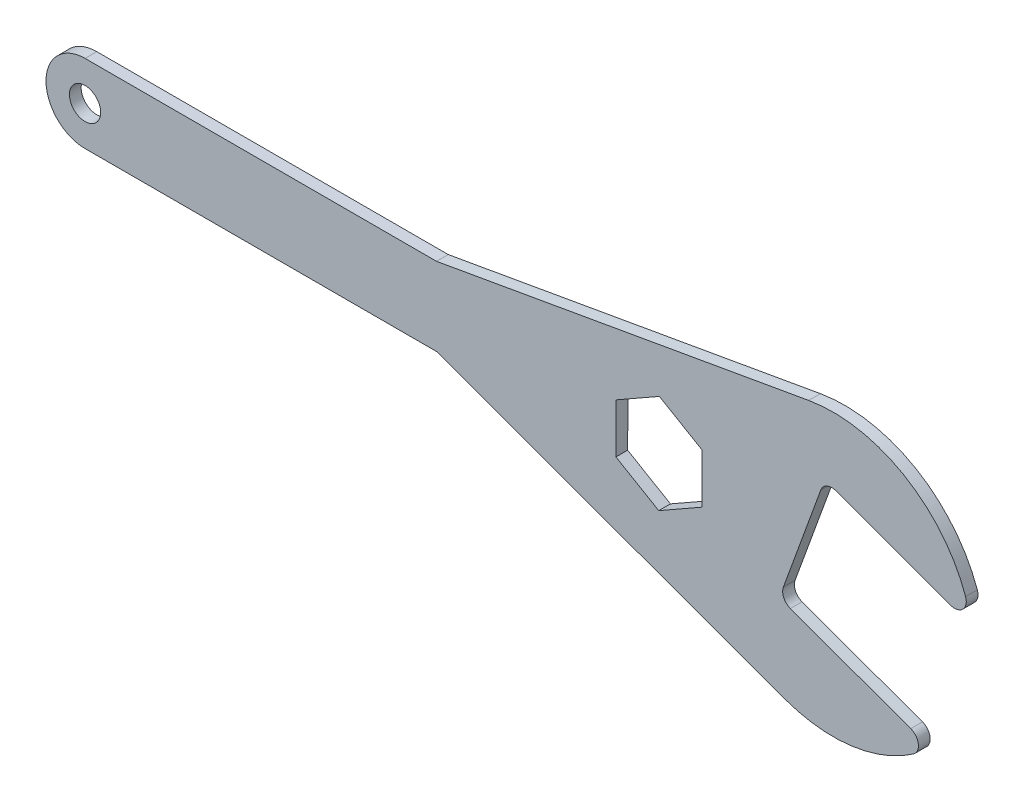
ISO-10303-21;
HEADER;
FILE_DESCRIPTION(('STEP AP214'),'2;1');
FILE_NAME('part.step','',(''),(''),'','','');
FILE_SCHEMA(('AUTOMOTIVE_DESIGN { 1 0 10303 214 1 1 1 1 }'));
ENDSEC;
DATA;
#1=APPLICATION_CONTEXT('core data for automotive mechanical design processes');
#2=APPLICATION_PROTOCOL_DEFINITION('international standard','automotive_design',2000,#1);
#3=PRODUCT_CONTEXT('',#1,'mechanical');
#4=PRODUCT('Part','Part','',(#3));
#5=PRODUCT_RELATED_PRODUCT_CATEGORY('part','',(#4));
#6=PRODUCT_DEFINITION_FORMATION('','',#4);
#7=PRODUCT_DEFINITION_CONTEXT('part definition',#1,'design');
#8=PRODUCT_DEFINITION('design','',#6,#7);
#9=PRODUCT_DEFINITION_SHAPE('','',#8);
#10=(LENGTH_UNIT() NAMED_UNIT(*) SI_UNIT(.MILLI.,.METRE.));
#11=(NAMED_UNIT(*) PLANE_ANGLE_UNIT() SI_UNIT($,.RADIAN.));
#12=(NAMED_UNIT(*) SI_UNIT($,.STERADIAN.) SOLID_ANGLE_UNIT());
#13=UNCERTAINTY_MEASURE_WITH_UNIT(LENGTH_MEASURE(1.E-05),#10,'distance_accuracy_value','');
#14=(GEOMETRIC_REPRESENTATION_CONTEXT(3) GLOBAL_UNCERTAINTY_ASSIGNED_CONTEXT((#13)) GLOBAL_UNIT_ASSIGNED_CONTEXT((#10,
#11,#12)) REPRESENTATION_CONTEXT('',''));
#15=CARTESIAN_POINT('',(0.,0.,0.));
#16=DIRECTION('',(0.,0.,1.));
#17=DIRECTION('',(1.,0.,0.));
#18=AXIS2_PLACEMENT_3D('',#15,#16,#17);
#19=CARTESIAN_POINT('',(90.,10.,3.));
#20=DIRECTION('',(0.173648177666924,-0.984807753012209,0.));
#21=DIRECTION('',(0.984807753012209,0.173648177666924,0.));
#22=AXIS2_PLACEMENT_3D('',#19,#20,#21);
#23=PLANE('',#22);
#24=DIRECTION('',(-0.984807753012209,-0.173648177666924,0.));
#25=VECTOR('',#24,1.);
#26=CARTESIAN_POINT('',(90.,10.,0.));
#27=LINE('',#26,#25);
#28=CARTESIAN_POINT('',(185.295586495551,26.8031830416023,0.));
#29=VERTEX_POINT('',#28);
#30=CARTESIAN_POINT('',(90.,10.,0.));
#31=VERTEX_POINT('',#30);
#32=EDGE_CURVE('E259',#29,#31,#27,.T.);
#33=ORIENTED_EDGE('',*,*,#32,.T.);
#34=DIRECTION('',(0.,0.,-1.));
#35=VECTOR('',#34,1.);
#36=CARTESIAN_POINT('',(90.,10.,3.));
#37=LINE('',#36,#35);
#38=CARTESIAN_POINT('',(90.,10.,3.));
#39=VERTEX_POINT('',#38);
#40=EDGE_CURVE('E296',#39,#31,#37,.T.);
#41=ORIENTED_EDGE('',*,*,#40,.F.);
#42=DIRECTION('',(-0.984807753012209,-0.173648177666924,0.));
#43=VECTOR('',#42,1.);
#44=CARTESIAN_POINT('',(90.,10.,3.));
#45=LINE('',#44,#43);
#46=CARTESIAN_POINT('',(185.295586495551,26.8031830416023,3.));
#47=VERTEX_POINT('',#46);
#48=EDGE_CURVE('E234',#47,#39,#45,.T.);
#49=ORIENTED_EDGE('',*,*,#48,.F.);
#50=DIRECTION('',(0.,0.,-1.));
#51=VECTOR('',#50,1.);
#52=CARTESIAN_POINT('',(185.295586495551,26.8031830416023,3.));
#53=LINE('',#52,#51);
#54=EDGE_CURVE('E258',#47,#29,#53,.T.);
#55=ORIENTED_EDGE('',*,*,#54,.T.);
#56=EDGE_LOOP('',(#33,#41,#49,#55));
#57=FACE_BOUND('',#56,.T.);
#58=ADVANCED_FACE('F36',(#57),#23,.F.);
#59=CARTESIAN_POINT('',(90.,10.,3.));
#60=DIRECTION('',(0.,-1.,0.));
#61=DIRECTION('',(1.,0.,0.));
#62=AXIS2_PLACEMENT_3D('',#59,#60,#61);
#63=PLANE('',#62);
#64=DIRECTION('',(-1.,0.,0.));
#65=VECTOR('',#64,1.);
#66=CARTESIAN_POINT('',(90.,10.,0.));
#67=LINE('',#66,#65);
#68=CARTESIAN_POINT('',(0.,10.,0.));
#69=VERTEX_POINT('',#68);
#70=EDGE_CURVE('E262',#31,#69,#67,.T.);
#71=ORIENTED_EDGE('',*,*,#70,.T.);
#72=DIRECTION('',(0.,0.,-1.));
#73=VECTOR('',#72,1.);
#74=CARTESIAN_POINT('',(0.,10.,3.));
#75=LINE('',#74,#73);
#76=CARTESIAN_POINT('',(0.,10.,3.));
#77=VERTEX_POINT('',#76);
#78=EDGE_CURVE('E293',#77,#69,#75,.T.);
#79=ORIENTED_EDGE('',*,*,#78,.F.);
#80=DIRECTION('',(-1.,0.,0.));
#81=VECTOR('',#80,1.);
#82=CARTESIAN_POINT('',(90.,10.,3.));
#83=LINE('',#82,#81);
#84=EDGE_CURVE('E237',#39,#77,#83,.T.);
#85=ORIENTED_EDGE('',*,*,#84,.F.);
#86=ORIENTED_EDGE('',*,*,#40,.T.);
#87=EDGE_LOOP('',(#71,#79,#85,#86));
#88=FACE_BOUND('',#87,.T.);
#89=ADVANCED_FACE('F375',(#88),#63,.F.);
#90=CARTESIAN_POINT('',(0.,0.,3.));
#91=DIRECTION('',(0.,0.,-1.));
#92=DIRECTION('',(-1.,0.,0.));
#93=AXIS2_PLACEMENT_3D('',#90,#91,#92);
#94=CYLINDRICAL_SURFACE('',#93,10.);
#95=CARTESIAN_POINT('',(0.,0.,0.));
#96=DIRECTION('',(0.,0.,1.));
#97=DIRECTION('',(1.,0.,0.));
#98=AXIS2_PLACEMENT_3D('',#95,#96,#97);
#99=CIRCLE('',#98,10.);
#100=CARTESIAN_POINT('',(0.,-10.,0.));
#101=VERTEX_POINT('',#100);
#102=EDGE_CURVE('E265',#69,#101,#99,.T.);
#103=ORIENTED_EDGE('',*,*,#102,.T.);
#104=DIRECTION('',(0.,0.,-1.));
#105=VECTOR('',#104,1.);
#106=CARTESIAN_POINT('',(0.,-10.,3.));
#107=LINE('',#106,#105);
#108=CARTESIAN_POINT('',(0.,-10.,3.));
#109=VERTEX_POINT('',#108);
#110=EDGE_CURVE('E290',#109,#101,#107,.T.);
#111=ORIENTED_EDGE('',*,*,#110,.F.);
#112=CARTESIAN_POINT('',(0.,0.,3.));
#113=DIRECTION('',(0.,0.,1.));
#114=DIRECTION('',(1.,0.,0.));
#115=AXIS2_PLACEMENT_3D('',#112,#113,#114);
#116=CIRCLE('',#115,10.);
#117=EDGE_CURVE('E240',#77,#109,#116,.T.);
#118=ORIENTED_EDGE('',*,*,#117,.F.);
#119=ORIENTED_EDGE('',*,*,#78,.T.);
#120=EDGE_LOOP('',(#103,#111,#118,#119));
#121=FACE_BOUND('',#120,.T.);
#122=ADVANCED_FACE('F378',(#121),#94,.T.);
#123=CARTESIAN_POINT('',(0.,-10.,3.));
#124=DIRECTION('',(0.,1.,0.));
#125=DIRECTION('',(0.,0.,1.));
#126=AXIS2_PLACEMENT_3D('',#123,#124,#125);
#127=PLANE('',#126);
#128=DIRECTION('',(1.,0.,0.));
#129=VECTOR('',#128,1.);
#130=CARTESIAN_POINT('',(0.,-10.,0.));
#131=LINE('',#130,#129);
#132=CARTESIAN_POINT('',(89.9993425559713,-10.,0.));
#133=VERTEX_POINT('',#132);
#134=EDGE_CURVE('E267',#101,#133,#131,.T.);
#135=ORIENTED_EDGE('',*,*,#134,.T.);
#136=DIRECTION('',(0.,0.,-1.));
#137=VECTOR('',#136,1.);
#138=CARTESIAN_POINT('',(89.9993425559713,-10.,3.));
#139=LINE('',#138,#137);
#140=CARTESIAN_POINT('',(89.9993425559713,-10.,3.));
#141=VERTEX_POINT('',#140);
#142=EDGE_CURVE('E287',#141,#133,#139,.T.);
#143=ORIENTED_EDGE('',*,*,#142,.F.);
#144=DIRECTION('',(1.,0.,0.));
#145=VECTOR('',#144,1.);
#146=CARTESIAN_POINT('',(0.,-10.,3.));
#147=LINE('',#146,#145);
#148=EDGE_CURVE('E242',#109,#141,#147,.T.);
#149=ORIENTED_EDGE('',*,*,#148,.F.);
#150=ORIENTED_EDGE('',*,*,#110,.T.);
#151=EDGE_LOOP('',(#135,#143,#149,#150));
#152=FACE_BOUND('',#151,.T.);
#153=ADVANCED_FACE('F383',(#152),#127,.F.);
#154=CARTESIAN_POINT('',(89.9993425559713,-10.,3.));
#155=DIRECTION('',(0.34202014332567,0.939692620785908,0.));
#156=DIRECTION('',(-0.939692620785908,0.34202014332567,0.));
#157=AXIS2_PLACEMENT_3D('',#154,#155,#156);
#158=PLANE('',#157);
#159=DIRECTION('',(0.939692620785908,-0.34202014332567,0.));
#160=VECTOR('',#159,1.);
#161=CARTESIAN_POINT('',(89.9993425559713,-10.,0.));
#162=LINE('',#161,#160);
#163=CARTESIAN_POINT('',(179.234195731836,-42.4788304151299,0.));
#164=VERTEX_POINT('',#163);
#165=EDGE_CURVE('E269',#133,#164,#162,.T.);
#166=ORIENTED_EDGE('',*,*,#165,.T.);
#167=DIRECTION('',(0.,0.,-1.));
#168=VECTOR('',#167,1.);
#169=CARTESIAN_POINT('',(179.234195731836,-42.4788304151299,3.));
#170=LINE('',#169,#168);
#171=CARTESIAN_POINT('',(179.234195731836,-42.4788304151299,3.));
#172=VERTEX_POINT('',#171);
#173=EDGE_CURVE('E284',#172,#164,#170,.T.);
#174=ORIENTED_EDGE('',*,*,#173,.F.);
#175=DIRECTION('',(0.939692620785908,-0.34202014332567,0.));
#176=VECTOR('',#175,1.);
#177=CARTESIAN_POINT('',(89.9993425559713,-10.,3.));
#178=LINE('',#177,#176);
#179=EDGE_CURVE('E244',#141,#172,#178,.T.);
#180=ORIENTED_EDGE('',*,*,#179,.F.);
#181=ORIENTED_EDGE('',*,*,#142,.T.);
#182=EDGE_LOOP('',(#166,#174,#180,#181));
#183=FACE_BOUND('',#182,.T.);
#184=ADVANCED_FACE('F387',(#183),#158,.F.);
#185=CARTESIAN_POINT('',(191.54692089156,-8.6498960668372,3.));
#186=DIRECTION('',(0.,0.,-1.));
#187=DIRECTION('',(-1.,0.,0.));
#188=AXIS2_PLACEMENT_3D('',#185,#186,#187);
#189=CYLINDRICAL_SURFACE('',#188,36.);
#190=CARTESIAN_POINT('',(191.54692089156,-8.6498960668372,0.));
#191=DIRECTION('',(0.,0.,1.));
#192=DIRECTION('',(1.,0.,0.));
#193=AXIS2_PLACEMENT_3D('',#190,#191,#192);
#194=CIRCLE('',#193,36.);
#195=CARTESIAN_POINT('',(212.117004910909,-38.1942972866446,0.));
#196=VERTEX_POINT('',#195);
#197=EDGE_CURVE('E271',#164,#196,#194,.T.);
#198=ORIENTED_EDGE('',*,*,#197,.T.);
#199=DIRECTION('',(0.,0.,-1.));
#200=VECTOR('',#199,1.);
#201=CARTESIAN_POINT('',(212.117004910909,-38.1942972866446,3.));
#202=LINE('',#201,#200);
#203=CARTESIAN_POINT('',(212.117004910909,-38.1942972866446,3.));
#204=VERTEX_POINT('',#203);
#205=EDGE_CURVE('E44',#196,#204,#202,.F.);
#206=ORIENTED_EDGE('',*,*,#205,.T.);
#207=CARTESIAN_POINT('',(191.54692089156,-8.6498960668372,3.));
#208=DIRECTION('',(0.,0.,1.));
#209=DIRECTION('',(1.,0.,0.));
#210=AXIS2_PLACEMENT_3D('',#207,#208,#209);
#211=CIRCLE('',#210,36.);
#212=EDGE_CURVE('E246',#172,#204,#211,.T.);
#213=ORIENTED_EDGE('',*,*,#212,.F.);
#214=ORIENTED_EDGE('',*,*,#173,.T.);
#215=EDGE_LOOP('',(#198,#206,#213,#214));
#216=FACE_BOUND('',#215,.T.);
#217=ADVANCED_FACE('F389',(#216),#189,.T.);
#218=CARTESIAN_POINT('',(216.37877505015,-34.7147962018179,3.));
#219=DIRECTION('',(-0.342020143325669,-0.939692620785908,0.));
#220=DIRECTION('',(0.939692620785908,-0.342020143325669,0.));
#221=AXIS2_PLACEMENT_3D('',#218,#219,#220);
#222=PLANE('',#221);
#223=DIRECTION('',(-0.939692620785908,0.34202014332567,0.));
#224=VECTOR('',#223,1.);
#225=CARTESIAN_POINT('',(216.37877505015,-34.7147962018179,3.));
#226=LINE('',#225,#224);
#227=CARTESIAN_POINT('',(211.428891672607,-32.913185989303,3.));
#228=VERTEX_POINT('',#227);
#229=CARTESIAN_POINT('',(180.602688157849,-21.6933654744988,3.));
#230=VERTEX_POINT('',#229);
#231=EDGE_CURVE('E248',#228,#230,#226,.T.);
#232=ORIENTED_EDGE('',*,*,#231,.F.);
#233=DIRECTION('',(0.,0.,-1.));
#234=VECTOR('',#233,1.);
#235=CARTESIAN_POINT('',(211.428891672607,-32.913185989303,3.));
#236=LINE('',#235,#234);
#237=CARTESIAN_POINT('',(211.428891672607,-32.913185989303,0.));
#238=VERTEX_POINT('',#237);
#239=EDGE_CURVE('E328',#228,#238,#236,.T.);
#240=ORIENTED_EDGE('',*,*,#239,.T.);
#241=DIRECTION('',(-0.939692620785908,0.34202014332567,0.));
#242=VECTOR('',#241,1.);
#243=CARTESIAN_POINT('',(216.37877505015,-34.7147962018179,0.));
#244=LINE('',#243,#242);
#245=CARTESIAN_POINT('',(180.602688157849,-21.6933654744988,0.));
#246=VERTEX_POINT('',#245);
#247=EDGE_CURVE('E273',#238,#246,#244,.T.);
#248=ORIENTED_EDGE('',*,*,#247,.T.);
#249=DIRECTION('',(0.,0.,-1.));
#250=VECTOR('',#249,1.);
#251=CARTESIAN_POINT('',(180.602688157849,-21.6933654744988,3.));
#252=LINE('',#251,#250);
#253=EDGE_CURVE('E302',#246,#230,#252,.F.);
#254=ORIENTED_EDGE('',*,*,#253,.T.);
#255=EDGE_LOOP('',(#232,#240,#248,#254));
#256=FACE_BOUND('',#255,.T.);
#257=ADVANCED_FACE('F334',(#256),#222,.F.);
#258=CARTESIAN_POINT('',(177.783610295491,-20.6673050445218,3.));
#259=DIRECTION('',(-0.939692620785908,0.34202014332567,0.));
#260=DIRECTION('',(-0.34202014332567,-0.939692620785908,0.));
#261=AXIS2_PLACEMENT_3D('',#258,#259,#260);
#262=PLANE('',#261);
#263=DIRECTION('',(0.34202014332567,0.939692620785908,0.));
#264=VECTOR('',#263,1.);
#265=CARTESIAN_POINT('',(177.783610295491,-20.6673050445218,0.));
#266=LINE('',#265,#264);
#267=CARTESIAN_POINT('',(178.809670725468,-17.8482271821641,0.));
#268=VERTEX_POINT('',#267);
#269=CARTESIAN_POINT('',(188.386234738587,8.46316619984133,0.));
#270=VERTEX_POINT('',#269);
#271=EDGE_CURVE('E275',#268,#270,#266,.T.);
#272=ORIENTED_EDGE('',*,*,#271,.T.);
#273=DIRECTION('',(0.,0.,-1.));
#274=VECTOR('',#273,1.);
#275=CARTESIAN_POINT('',(188.386234738587,8.46316619984133,3.));
#276=LINE('',#275,#274);
#277=CARTESIAN_POINT('',(188.386234738587,8.46316619984133,3.));
#278=VERTEX_POINT('',#277);
#279=EDGE_CURVE('E313',#270,#278,#276,.F.);
#280=ORIENTED_EDGE('',*,*,#279,.T.);
#281=DIRECTION('',(0.34202014332567,0.939692620785908,0.));
#282=VECTOR('',#281,1.);
#283=CARTESIAN_POINT('',(177.783610295491,-20.6673050445218,3.));
#284=LINE('',#283,#282);
#285=CARTESIAN_POINT('',(178.809670725468,-17.8482271821641,3.));
#286=VERTEX_POINT('',#285);
#287=EDGE_CURVE('E250',#286,#278,#284,.T.);
#288=ORIENTED_EDGE('',*,*,#287,.F.);
#289=DIRECTION('',(0.,0.,-1.));
#290=VECTOR('',#289,1.);
#291=CARTESIAN_POINT('',(178.809670725468,-17.8482271821641,0.));
#292=LINE('',#291,#290);
#293=EDGE_CURVE('E299',#286,#268,#292,.T.);
#294=ORIENTED_EDGE('',*,*,#293,.T.);
#295=EDGE_LOOP('',(#272,#280,#288,#294));
#296=FACE_BOUND('',#295,.T.);
#297=ADVANCED_FACE('F348',(#296),#262,.F.);
#298=CARTESIAN_POINT('',(189.412295168564,11.2822440621991,3.));
#299=DIRECTION('',(0.342020143325669,0.939692620785908,0.));
#300=DIRECTION('',(-0.939692620785908,0.342020143325669,0.));
#301=AXIS2_PLACEMENT_3D('',#298,#299,#300);
#302=PLANE('',#301);
#303=DIRECTION('',(0.939692620785908,-0.342020143325669,0.));
#304=VECTOR('',#303,1.);
#305=CARTESIAN_POINT('',(189.412295168564,11.2822440621991,0.));
#306=LINE('',#305,#304);
#307=CARTESIAN_POINT('',(192.231373030921,10.2561836322221,0.));
#308=VERTEX_POINT('',#307);
#309=CARTESIAN_POINT('',(221.623952349415,-0.441840348017959,0.));
#310=VERTEX_POINT('',#309);
#311=EDGE_CURVE('E278',#308,#310,#306,.T.);
#312=ORIENTED_EDGE('',*,*,#311,.T.);
#313=DIRECTION('',(0.,0.,-1.));
#314=VECTOR('',#313,1.);
#315=CARTESIAN_POINT('',(221.623952349415,-0.441840348017964,3.));
#316=LINE('',#315,#314);
#317=CARTESIAN_POINT('',(221.623952349415,-0.441840348017959,3.));
#318=VERTEX_POINT('',#317);
#319=EDGE_CURVE('E324',#310,#318,#316,.F.);
#320=ORIENTED_EDGE('',*,*,#319,.T.);
#321=DIRECTION('',(0.939692620785908,-0.342020143325669,0.));
#322=VECTOR('',#321,1.);
#323=CARTESIAN_POINT('',(189.412295168564,11.2822440621991,3.));
#324=LINE('',#323,#322);
#325=CARTESIAN_POINT('',(192.231373030921,10.2561836322221,3.));
#326=VERTEX_POINT('',#325);
#327=EDGE_CURVE('E253',#326,#318,#324,.T.);
#328=ORIENTED_EDGE('',*,*,#327,.F.);
#329=DIRECTION('',(0.,0.,-1.));
#330=VECTOR('',#329,1.);
#331=CARTESIAN_POINT('',(192.231373030921,10.2561836322221,0.));
#332=LINE('',#331,#330);
#333=EDGE_CURVE('E310',#326,#308,#332,.T.);
#334=ORIENTED_EDGE('',*,*,#333,.T.);
#335=EDGE_LOOP('',(#312,#320,#328,#334));
#336=FACE_BOUND('',#335,.T.);
#337=ADVANCED_FACE('F356',(#336),#302,.F.);
#338=CARTESIAN_POINT('',(191.54692089156,-8.6498960668372,3.));
#339=DIRECTION('',(0.,0.,-1.));
#340=DIRECTION('',(-1.,0.,0.));
#341=AXIS2_PLACEMENT_3D('',#338,#339,#340);
#342=CYLINDRICAL_SURFACE('',#341,36.);
#343=CARTESIAN_POINT('',(191.54692089156,-8.6498960668372,3.));
#344=DIRECTION('',(0.,0.,1.));
#345=DIRECTION('',(-1.,0.,0.));
#346=AXIS2_PLACEMENT_3D('',#343,#344,#345);
#347=CIRCLE('',#346,36.);
#348=CARTESIAN_POINT('',(225.477566587376,3.37970420353768,3.));
#349=VERTEX_POINT('',#348);
#350=EDGE_CURVE('E256',#349,#47,#347,.T.);
#351=ORIENTED_EDGE('',*,*,#350,.F.);
#352=DIRECTION('',(0.,0.,-1.));
#353=VECTOR('',#352,1.);
#354=CARTESIAN_POINT('',(225.477566587376,3.37970420353767,3.));
#355=LINE('',#354,#353);
#356=CARTESIAN_POINT('',(225.477566587376,3.37970420353768,0.));
#357=VERTEX_POINT('',#356);
#358=EDGE_CURVE('E319',#349,#357,#355,.T.);
#359=ORIENTED_EDGE('',*,*,#358,.T.);
#360=CARTESIAN_POINT('',(191.54692089156,-8.6498960668372,0.));
#361=DIRECTION('',(0.,0.,1.));
#362=DIRECTION('',(-1.,0.,0.));
#363=AXIS2_PLACEMENT_3D('',#360,#361,#362);
#364=CIRCLE('',#363,36.);
#365=EDGE_CURVE('E238',#357,#29,#364,.T.);
#366=ORIENTED_EDGE('',*,*,#365,.T.);
#367=ORIENTED_EDGE('',*,*,#54,.F.);
#368=EDGE_LOOP('',(#351,#359,#366,#367));
#369=FACE_BOUND('',#368,.T.);
#370=ADVANCED_FACE('F365',(#369),#342,.T.);
#371=CARTESIAN_POINT('',(191.54692089156,-8.6498960668372,3.));
#372=DIRECTION('',(0.,0.,-1.));
#373=DIRECTION('',(-1.,0.,0.));
#374=AXIS2_PLACEMENT_3D('',#371,#372,#373);
#375=PLANE('',#374);
#376=CARTESIAN_POINT('',(0.,0.,3.));
#377=DIRECTION('',(0.,0.,1.));
#378=DIRECTION('',(1.,0.,0.));
#379=AXIS2_PLACEMENT_3D('',#376,#377,#378);
#380=CIRCLE('',#379,4.);
#381=CARTESIAN_POINT('',(4.,0.,3.));
#382=VERTEX_POINT('',#381);
#383=EDGE_CURVE('E204',#382,#382,#380,.T.);
#384=ORIENTED_EDGE('',*,*,#383,.F.);
#385=EDGE_LOOP('',(#384));
#386=FACE_BOUND('',#385,.T.);
#387=DIRECTION('',(0.00623833591572939,0.999980541393183,0.));
#388=VECTOR('',#387,1.);
#389=CARTESIAN_POINT('',(157.937239428555,-10.5531043819596,3.));
#390=LINE('',#389,#388);
#391=CARTESIAN_POINT('',(157.937239428555,-10.5531043819596,3.));
#392=VERTEX_POINT('',#391);
#393=CARTESIAN_POINT('',(158.016476936801,2.14835438271065,3.));
#394=VERTEX_POINT('',#393);
#395=EDGE_CURVE('E215',#392,#394,#390,.T.);
#396=ORIENTED_EDGE('',*,*,#395,.F.);
#397=DIRECTION('',(0.869127720094477,0.494587713316229,0.));
#398=VECTOR('',#397,1.);
#399=CARTESIAN_POINT('',(146.897834719108,-16.8352120692218,3.));
#400=LINE('',#399,#398);
#401=CARTESIAN_POINT('',(146.897834719108,-16.8352120692218,3.));
#402=VERTEX_POINT('',#401);
#403=EDGE_CURVE('E180',#402,#392,#400,.T.);
#404=ORIENTED_EDGE('',*,*,#403,.F.);
#405=DIRECTION('',(0.862889384178747,-0.505392828076955,0.));
#406=VECTOR('',#405,1.);
#407=CARTESIAN_POINT('',(135.937667517905,-10.4158609918136,3.));
#408=LINE('',#407,#406);
#409=CARTESIAN_POINT('',(135.937667517905,-10.4158609918136,3.));
#410=VERTEX_POINT('',#409);
#411=EDGE_CURVE('E198',#410,#402,#408,.T.);
#412=ORIENTED_EDGE('',*,*,#411,.F.);
#413=DIRECTION('',(-0.0062383359157294,-0.999980541393182,0.));
#414=VECTOR('',#413,1.);
#415=CARTESIAN_POINT('',(136.016905026151,2.28559777285671,3.));
#416=LINE('',#415,#414);
#417=CARTESIAN_POINT('',(136.016905026151,2.28559777285671,3.));
#418=VERTEX_POINT('',#417);
#419=EDGE_CURVE('E201',#418,#410,#416,.T.);
#420=ORIENTED_EDGE('',*,*,#419,.F.);
#421=DIRECTION('',(-0.869127720094478,-0.494587713316228,0.));
#422=VECTOR('',#421,1.);
#423=CARTESIAN_POINT('',(147.056309735598,8.56770546011883,3.));
#424=LINE('',#423,#422);
#425=CARTESIAN_POINT('',(147.056309735598,8.56770546011883,3.));
#426=VERTEX_POINT('',#425);
#427=EDGE_CURVE('E220',#426,#418,#424,.T.);
#428=ORIENTED_EDGE('',*,*,#427,.F.);
#429=DIRECTION('',(-0.862889384178747,0.505392828076955,0.));
#430=VECTOR('',#429,1.);
#431=CARTESIAN_POINT('',(158.016476936801,2.14835438271065,3.));
#432=LINE('',#431,#430);
#433=EDGE_CURVE('E217',#394,#426,#432,.T.);
#434=ORIENTED_EDGE('',*,*,#433,.F.);
#435=EDGE_LOOP('',(#396,#404,#412,#420,#428,#434));
#436=FACE_BOUND('',#435,.T.);
#437=ORIENTED_EDGE('',*,*,#212,.T.);
#438=CARTESIAN_POINT('',(210.40283124263,-35.7322638516607,3.));
#439=DIRECTION('',(0.,0.,-1.));
#440=DIRECTION('',(-1.,0.,0.));
#441=AXIS2_PLACEMENT_3D('',#438,#439,#440);
#442=CIRCLE('',#441,3.);
#443=EDGE_CURVE('E11',#204,#228,#442,.F.);
#444=ORIENTED_EDGE('',*,*,#443,.T.);
#445=ORIENTED_EDGE('',*,*,#231,.T.);
#446=CARTESIAN_POINT('',(181.628748587826,-18.8742876121411,3.));
#447=DIRECTION('',(0.,0.,-1.));
#448=DIRECTION('',(-1.,0.,0.));
#449=AXIS2_PLACEMENT_3D('',#446,#447,#448);
#450=CIRCLE('',#449,3.);
#451=EDGE_CURVE('E308',#230,#286,#450,.T.);
#452=ORIENTED_EDGE('',*,*,#451,.T.);
#453=ORIENTED_EDGE('',*,*,#287,.T.);
#454=CARTESIAN_POINT('',(191.205312600944,7.43710576986432,3.));
#455=DIRECTION('',(0.,0.,-1.));
#456=DIRECTION('',(-1.,0.,0.));
#457=AXIS2_PLACEMENT_3D('',#454,#455,#456);
#458=CIRCLE('',#457,3.);
#459=EDGE_CURVE('E317',#278,#326,#458,.T.);
#460=ORIENTED_EDGE('',*,*,#459,.T.);
#461=ORIENTED_EDGE('',*,*,#327,.T.);
#462=CARTESIAN_POINT('',(222.650012779392,2.37723751433976,3.));
#463=DIRECTION('',(0.,0.,-1.));
#464=DIRECTION('',(-1.,0.,0.));
#465=AXIS2_PLACEMENT_3D('',#462,#463,#464);
#466=CIRCLE('',#465,3.);
#467=EDGE_CURVE('E326',#318,#349,#466,.F.);
#468=ORIENTED_EDGE('',*,*,#467,.T.);
#469=ORIENTED_EDGE('',*,*,#350,.T.);
#470=ORIENTED_EDGE('',*,*,#48,.T.);
#471=ORIENTED_EDGE('',*,*,#84,.T.);
#472=ORIENTED_EDGE('',*,*,#117,.T.);
#473=ORIENTED_EDGE('',*,*,#148,.T.);
#474=ORIENTED_EDGE('',*,*,#179,.T.);
#475=EDGE_LOOP('',(#437,#444,#445,#452,#453,#460,#461,#468,#469,#470,#471,#472,#473,#474));
#476=FACE_BOUND('',#475,.T.);
#477=ADVANCED_FACE('F345',(#386,#436,#476),#375,.F.);
#478=CARTESIAN_POINT('',(191.54692089156,-8.6498960668372,0.));
#479=DIRECTION('',(0.,0.,-1.));
#480=DIRECTION('',(-1.,0.,0.));
#481=AXIS2_PLACEMENT_3D('',#478,#479,#480);
#482=PLANE('',#481);
#483=CARTESIAN_POINT('',(0.,0.,0.));
#484=DIRECTION('',(0.,0.,1.));
#485=DIRECTION('',(1.,0.,0.));
#486=AXIS2_PLACEMENT_3D('',#483,#484,#485);
#487=CIRCLE('',#486,4.);
#488=CARTESIAN_POINT('',(4.,0.,0.));
#489=VERTEX_POINT('',#488);
#490=EDGE_CURVE('E263',#489,#489,#487,.T.);
#491=ORIENTED_EDGE('',*,*,#490,.T.);
#492=EDGE_LOOP('',(#491));
#493=FACE_BOUND('',#492,.T.);
#494=DIRECTION('',(0.869127720094477,0.494587713316229,0.));
#495=VECTOR('',#494,1.);
#496=CARTESIAN_POINT('',(146.897834719108,-16.8352120692218,0.));
#497=LINE('',#496,#495);
#498=CARTESIAN_POINT('',(146.897834719108,-16.8352120692218,0.));
#499=VERTEX_POINT('',#498);
#500=CARTESIAN_POINT('',(157.937239428555,-10.5531043819596,0.));
#501=VERTEX_POINT('',#500);
#502=EDGE_CURVE('E177',#499,#501,#497,.T.);
#503=ORIENTED_EDGE('',*,*,#502,.T.);
#504=DIRECTION('',(0.00623833591572939,0.999980541393183,0.));
#505=VECTOR('',#504,1.);
#506=CARTESIAN_POINT('',(157.937239428555,-10.5531043819596,0.));
#507=LINE('',#506,#505);
#508=CARTESIAN_POINT('',(158.016476936801,2.14835438271065,0.));
#509=VERTEX_POINT('',#508);
#510=EDGE_CURVE('E189',#501,#509,#507,.T.);
#511=ORIENTED_EDGE('',*,*,#510,.T.);
#512=DIRECTION('',(-0.862889384178747,0.505392828076955,0.));
#513=VECTOR('',#512,1.);
#514=CARTESIAN_POINT('',(158.016476936801,2.14835438271065,0.));
#515=LINE('',#514,#513);
#516=CARTESIAN_POINT('',(147.056309735598,8.56770546011883,0.));
#517=VERTEX_POINT('',#516);
#518=EDGE_CURVE('E193',#509,#517,#515,.T.);
#519=ORIENTED_EDGE('',*,*,#518,.T.);
#520=DIRECTION('',(-0.869127720094478,-0.494587713316228,0.));
#521=VECTOR('',#520,1.);
#522=CARTESIAN_POINT('',(147.056309735598,8.56770546011883,0.));
#523=LINE('',#522,#521);
#524=CARTESIAN_POINT('',(136.016905026151,2.28559777285671,0.));
#525=VERTEX_POINT('',#524);
#526=EDGE_CURVE('E208',#517,#525,#523,.T.);
#527=ORIENTED_EDGE('',*,*,#526,.T.);
#528=DIRECTION('',(-0.0062383359157294,-0.999980541393182,0.));
#529=VECTOR('',#528,1.);
#530=CARTESIAN_POINT('',(136.016905026151,2.28559777285671,0.));
#531=LINE('',#530,#529);
#532=CARTESIAN_POINT('',(135.937667517905,-10.4158609918136,0.));
#533=VERTEX_POINT('',#532);
#534=EDGE_CURVE('E211',#525,#533,#531,.T.);
#535=ORIENTED_EDGE('',*,*,#534,.T.);
#536=DIRECTION('',(0.862889384178747,-0.505392828076955,0.));
#537=VECTOR('',#536,1.);
#538=CARTESIAN_POINT('',(135.937667517905,-10.4158609918136,0.));
#539=LINE('',#538,#537);
#540=EDGE_CURVE('E185',#533,#499,#539,.T.);
#541=ORIENTED_EDGE('',*,*,#540,.T.);
#542=EDGE_LOOP('',(#503,#511,#519,#527,#535,#541));
#543=FACE_BOUND('',#542,.T.);
#544=ORIENTED_EDGE('',*,*,#247,.F.);
#545=CARTESIAN_POINT('',(210.40283124263,-35.7322638516607,0.));
#546=DIRECTION('',(0.,0.,-1.));
#547=DIRECTION('',(-1.,0.,0.));
#548=AXIS2_PLACEMENT_3D('',#545,#546,#547);
#549=CIRCLE('',#548,3.);
#550=EDGE_CURVE('E58',#238,#196,#549,.T.);
#551=ORIENTED_EDGE('',*,*,#550,.T.);
#552=ORIENTED_EDGE('',*,*,#197,.F.);
#553=ORIENTED_EDGE('',*,*,#165,.F.);
#554=ORIENTED_EDGE('',*,*,#134,.F.);
#555=ORIENTED_EDGE('',*,*,#102,.F.);
#556=ORIENTED_EDGE('',*,*,#70,.F.);
#557=ORIENTED_EDGE('',*,*,#32,.F.);
#558=ORIENTED_EDGE('',*,*,#365,.F.);
#559=CARTESIAN_POINT('',(222.650012779392,2.37723751433976,0.));
#560=DIRECTION('',(0.,0.,-1.));
#561=DIRECTION('',(-1.,0.,0.));
#562=AXIS2_PLACEMENT_3D('',#559,#560,#561);
#563=CIRCLE('',#562,3.);
#564=EDGE_CURVE('E322',#357,#310,#563,.T.);
#565=ORIENTED_EDGE('',*,*,#564,.T.);
#566=ORIENTED_EDGE('',*,*,#311,.F.);
#567=CARTESIAN_POINT('',(191.205312600944,7.43710576986432,0.));
#568=DIRECTION('',(0.,0.,-1.));
#569=DIRECTION('',(-1.,0.,0.));
#570=AXIS2_PLACEMENT_3D('',#567,#568,#569);
#571=CIRCLE('',#570,3.);
#572=EDGE_CURVE('E315',#308,#270,#571,.F.);
#573=ORIENTED_EDGE('',*,*,#572,.T.);
#574=ORIENTED_EDGE('',*,*,#271,.F.);
#575=CARTESIAN_POINT('',(181.628748587826,-18.8742876121411,0.));
#576=DIRECTION('',(0.,0.,-1.));
#577=DIRECTION('',(-1.,0.,0.));
#578=AXIS2_PLACEMENT_3D('',#575,#576,#577);
#579=CIRCLE('',#578,3.);
#580=EDGE_CURVE('E305',#268,#246,#579,.F.);
#581=ORIENTED_EDGE('',*,*,#580,.T.);
#582=EDGE_LOOP('',(#544,#551,#552,#553,#554,#555,#556,#557,#558,#565,#566,#573,#574,#581));
#583=FACE_BOUND('',#582,.T.);
#584=ADVANCED_FACE('F195',(#493,#543,#583),#482,.T.);
#585=CARTESIAN_POINT('',(146.897834719108,-16.8352120692218,0.));
#586=DIRECTION('',(0.494587713316229,-0.869127720094477,0.));
#587=DIRECTION('',(0.869127720094477,0.494587713316229,0.));
#588=AXIS2_PLACEMENT_3D('',#585,#586,#587);
#589=PLANE('',#588);
#590=ORIENTED_EDGE('',*,*,#403,.T.);
#591=DIRECTION('',(0.,0.,1.));
#592=VECTOR('',#591,1.);
#593=CARTESIAN_POINT('',(157.937239428555,-10.5531043819596,0.));
#594=LINE('',#593,#592);
#595=EDGE_CURVE('E173',#501,#392,#594,.T.);
#596=ORIENTED_EDGE('',*,*,#595,.F.);
#597=ORIENTED_EDGE('',*,*,#502,.F.);
#598=DIRECTION('',(0.,0.,1.));
#599=VECTOR('',#598,1.);
#600=CARTESIAN_POINT('',(146.897834719108,-16.8352120692218,0.));
#601=LINE('',#600,#599);
#602=EDGE_CURVE('E225',#499,#402,#601,.T.);
#603=ORIENTED_EDGE('',*,*,#602,.T.);
#604=EDGE_LOOP('',(#590,#596,#597,#603));
#605=FACE_BOUND('',#604,.T.);
#606=ADVANCED_FACE('F175',(#605),#589,.F.);
#607=CARTESIAN_POINT('',(135.937667517905,-10.4158609918136,0.));
#608=DIRECTION('',(-0.505392828076955,-0.862889384178747,0.));
#609=DIRECTION('',(0.862889384178747,-0.505392828076955,0.));
#610=AXIS2_PLACEMENT_3D('',#607,#608,#609);
#611=PLANE('',#610);
#612=ORIENTED_EDGE('',*,*,#411,.T.);
#613=ORIENTED_EDGE('',*,*,#602,.F.);
#614=ORIENTED_EDGE('',*,*,#540,.F.);
#615=DIRECTION('',(0.,0.,1.));
#616=VECTOR('',#615,1.);
#617=CARTESIAN_POINT('',(135.937667517905,-10.4158609918136,0.));
#618=LINE('',#617,#616);
#619=EDGE_CURVE('E227',#533,#410,#618,.T.);
#620=ORIENTED_EDGE('',*,*,#619,.T.);
#621=EDGE_LOOP('',(#612,#613,#614,#620));
#622=FACE_BOUND('',#621,.T.);
#623=ADVANCED_FACE('F534',(#622),#611,.F.);
#624=CARTESIAN_POINT('',(136.016905026151,2.28559777285671,0.));
#625=DIRECTION('',(-0.999980541393183,0.0062383359157294,0.));
#626=DIRECTION('',(-0.0062383359157294,-0.999980541393183,0.));
#627=AXIS2_PLACEMENT_3D('',#624,#625,#626);
#628=PLANE('',#627);
#629=ORIENTED_EDGE('',*,*,#419,.T.);
#630=ORIENTED_EDGE('',*,*,#619,.F.);
#631=ORIENTED_EDGE('',*,*,#534,.F.);
#632=DIRECTION('',(0.,0.,1.));
#633=VECTOR('',#632,1.);
#634=CARTESIAN_POINT('',(136.016905026151,2.28559777285671,0.));
#635=LINE('',#634,#633);
#636=EDGE_CURVE('E229',#525,#418,#635,.T.);
#637=ORIENTED_EDGE('',*,*,#636,.T.);
#638=EDGE_LOOP('',(#629,#630,#631,#637));
#639=FACE_BOUND('',#638,.T.);
#640=ADVANCED_FACE('F524',(#639),#628,.F.);
#641=CARTESIAN_POINT('',(147.056309735598,8.56770546011883,0.));
#642=DIRECTION('',(-0.494587713316228,0.869127720094478,0.));
#643=DIRECTION('',(-0.869127720094478,-0.494587713316228,0.));
#644=AXIS2_PLACEMENT_3D('',#641,#642,#643);
#645=PLANE('',#644);
#646=ORIENTED_EDGE('',*,*,#427,.T.);
#647=ORIENTED_EDGE('',*,*,#636,.F.);
#648=ORIENTED_EDGE('',*,*,#526,.F.);
#649=DIRECTION('',(0.,0.,1.));
#650=VECTOR('',#649,1.);
#651=CARTESIAN_POINT('',(147.056309735598,8.56770546011883,0.));
#652=LINE('',#651,#650);
#653=EDGE_CURVE('E231',#517,#426,#652,.T.);
#654=ORIENTED_EDGE('',*,*,#653,.T.);
#655=EDGE_LOOP('',(#646,#647,#648,#654));
#656=FACE_BOUND('',#655,.T.);
#657=ADVANCED_FACE('F514',(#656),#645,.F.);
#658=CARTESIAN_POINT('',(158.016476936801,2.14835438271065,0.));
#659=DIRECTION('',(0.505392828076955,0.862889384178747,0.));
#660=DIRECTION('',(-0.862889384178747,0.505392828076955,0.));
#661=AXIS2_PLACEMENT_3D('',#658,#659,#660);
#662=PLANE('',#661);
#663=ORIENTED_EDGE('',*,*,#433,.T.);
#664=ORIENTED_EDGE('',*,*,#653,.F.);
#665=ORIENTED_EDGE('',*,*,#518,.F.);
#666=DIRECTION('',(0.,0.,1.));
#667=VECTOR('',#666,1.);
#668=CARTESIAN_POINT('',(158.016476936801,2.14835438271065,0.));
#669=LINE('',#668,#667);
#670=EDGE_CURVE('E184',#509,#394,#669,.T.);
#671=ORIENTED_EDGE('',*,*,#670,.T.);
#672=EDGE_LOOP('',(#663,#664,#665,#671));
#673=FACE_BOUND('',#672,.T.);
#674=ADVANCED_FACE('F505',(#673),#662,.F.);
#675=CARTESIAN_POINT('',(157.937239428555,-10.5531043819596,0.));
#676=DIRECTION('',(0.999980541393182,-0.00623833591572939,0.));
#677=DIRECTION('',(0.00623833591572939,0.999980541393183,0.));
#678=AXIS2_PLACEMENT_3D('',#675,#676,#677);
#679=PLANE('',#678);
#680=ORIENTED_EDGE('',*,*,#395,.T.);
#681=ORIENTED_EDGE('',*,*,#670,.F.);
#682=ORIENTED_EDGE('',*,*,#510,.F.);
#683=ORIENTED_EDGE('',*,*,#595,.T.);
#684=EDGE_LOOP('',(#680,#681,#682,#683));
#685=FACE_BOUND('',#684,.T.);
#686=ADVANCED_FACE('F190',(#685),#679,.F.);
#687=CARTESIAN_POINT('',(0.,0.,0.));
#688=DIRECTION('',(0.,0.,1.));
#689=DIRECTION('',(1.,0.,0.));
#690=AXIS2_PLACEMENT_3D('',#687,#688,#689);
#691=CYLINDRICAL_SURFACE('',#690,4.);
#692=ORIENTED_EDGE('',*,*,#490,.F.);
#693=EDGE_LOOP('',(#692));
#694=FACE_BOUND('',#693,.T.);
#695=ORIENTED_EDGE('',*,*,#383,.T.);
#696=EDGE_LOOP('',(#695));
#697=FACE_BOUND('',#696,.T.);
#698=ADVANCED_FACE('F408',(#694,#697),#691,.F.);
#699=CARTESIAN_POINT('',(181.628748587826,-18.8742876121411,3.));
#700=DIRECTION('',(0.,0.,1.));
#701=DIRECTION('',(1.,0.,0.));
#702=AXIS2_PLACEMENT_3D('',#699,#700,#701);
#703=CYLINDRICAL_SURFACE('',#702,3.);
#704=ORIENTED_EDGE('',*,*,#451,.F.);
#705=ORIENTED_EDGE('',*,*,#253,.F.);
#706=ORIENTED_EDGE('',*,*,#580,.F.);
#707=ORIENTED_EDGE('',*,*,#293,.F.);
#708=EDGE_LOOP('',(#704,#705,#706,#707));
#709=FACE_BOUND('',#708,.T.);
#710=ADVANCED_FACE('F342',(#709),#703,.F.);
#711=CARTESIAN_POINT('',(191.205312600944,7.43710576986432,3.));
#712=DIRECTION('',(0.,0.,1.));
#713=DIRECTION('',(1.,0.,0.));
#714=AXIS2_PLACEMENT_3D('',#711,#712,#713);
#715=CYLINDRICAL_SURFACE('',#714,3.);
#716=ORIENTED_EDGE('',*,*,#459,.F.);
#717=ORIENTED_EDGE('',*,*,#279,.F.);
#718=ORIENTED_EDGE('',*,*,#572,.F.);
#719=ORIENTED_EDGE('',*,*,#333,.F.);
#720=EDGE_LOOP('',(#716,#717,#718,#719));
#721=FACE_BOUND('',#720,.T.);
#722=ADVANCED_FACE('F351',(#721),#715,.F.);
#723=CARTESIAN_POINT('',(222.650012779392,2.37723751433976,3.));
#724=DIRECTION('',(0.,0.,-1.));
#725=DIRECTION('',(-1.,0.,0.));
#726=AXIS2_PLACEMENT_3D('',#723,#724,#725);
#727=CYLINDRICAL_SURFACE('',#726,3.);
#728=ORIENTED_EDGE('',*,*,#467,.F.);
#729=ORIENTED_EDGE('',*,*,#319,.F.);
#730=ORIENTED_EDGE('',*,*,#564,.F.);
#731=ORIENTED_EDGE('',*,*,#358,.F.);
#732=EDGE_LOOP('',(#728,#729,#730,#731));
#733=FACE_BOUND('',#732,.T.);
#734=ADVANCED_FACE('F360',(#733),#727,.T.);
#735=CARTESIAN_POINT('',(210.40283124263,-35.7322638516607,3.));
#736=DIRECTION('',(0.,0.,-1.));
#737=DIRECTION('',(-1.,0.,0.));
#738=AXIS2_PLACEMENT_3D('',#735,#736,#737);
#739=CYLINDRICAL_SURFACE('',#738,3.);
#740=ORIENTED_EDGE('',*,*,#443,.F.);
#741=ORIENTED_EDGE('',*,*,#205,.F.);
#742=ORIENTED_EDGE('',*,*,#550,.F.);
#743=ORIENTED_EDGE('',*,*,#239,.F.);
#744=EDGE_LOOP('',(#740,#741,#742,#743));
#745=FACE_BOUND('',#744,.T.);
#746=ADVANCED_FACE('F38',(#745),#739,.T.);
#747=CLOSED_SHELL('',(#58,#89,#122,#153,#184,#217,#257,#297,#337,#370,#477,#584,#606,#623,#640,
#657,#674,#686,#698,#710,#722,#734,#746));
#748=MANIFOLD_SOLID_BREP('B2',#747);
#749=ADVANCED_BREP_SHAPE_REPRESENTATION('',(#18,#748),#14);
#750=SHAPE_DEFINITION_REPRESENTATION(#9,#749);
ENDSEC;
END-ISO-10303-21;
